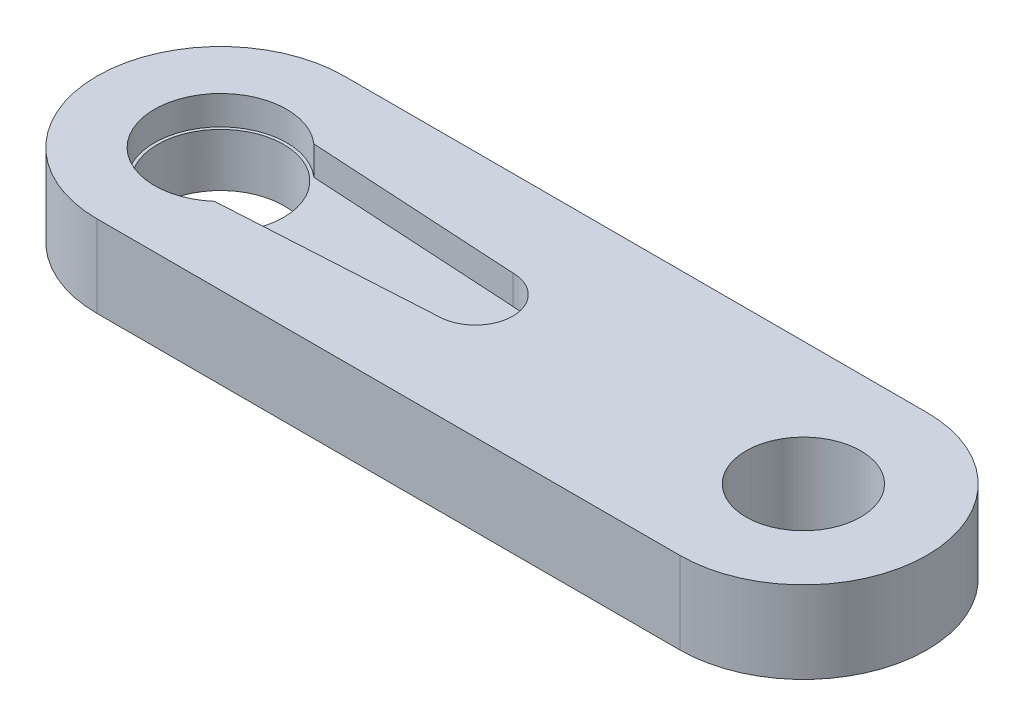
ISO-10303-21;
HEADER;
FILE_DESCRIPTION(('STEP AP214'),'2;1');
FILE_NAME('part.step','',(''),(''),'','','');
FILE_SCHEMA(('AUTOMOTIVE_DESIGN { 1 0 10303 214 1 1 1 1 }'));
ENDSEC;
DATA;
#1=APPLICATION_CONTEXT('core data for automotive mechanical design processes');
#2=APPLICATION_PROTOCOL_DEFINITION('international standard','automotive_design',2000,#1);
#3=PRODUCT_CONTEXT('',#1,'mechanical');
#4=PRODUCT('Part','Part','',(#3));
#5=PRODUCT_RELATED_PRODUCT_CATEGORY('part','',(#4));
#6=PRODUCT_DEFINITION_FORMATION('','',#4);
#7=PRODUCT_DEFINITION_CONTEXT('part definition',#1,'design');
#8=PRODUCT_DEFINITION('design','',#6,#7);
#9=PRODUCT_DEFINITION_SHAPE('','',#8);
#10=(LENGTH_UNIT() NAMED_UNIT(*) SI_UNIT(.MILLI.,.METRE.));
#11=(NAMED_UNIT(*) PLANE_ANGLE_UNIT() SI_UNIT($,.RADIAN.));
#12=(NAMED_UNIT(*) SI_UNIT($,.STERADIAN.) SOLID_ANGLE_UNIT());
#13=UNCERTAINTY_MEASURE_WITH_UNIT(LENGTH_MEASURE(1.E-05),#10,'distance_accuracy_value','');
#14=(GEOMETRIC_REPRESENTATION_CONTEXT(3) GLOBAL_UNCERTAINTY_ASSIGNED_CONTEXT((#13)) GLOBAL_UNIT_ASSIGNED_CONTEXT((#10,
#11,#12)) REPRESENTATION_CONTEXT('',''));
#15=CARTESIAN_POINT('',(0.,0.,0.));
#16=DIRECTION('',(0.,0.,1.));
#17=DIRECTION('',(1.,0.,0.));
#18=AXIS2_PLACEMENT_3D('',#15,#16,#17);
#19=CARTESIAN_POINT('',(33.,3.,0.));
#20=DIRECTION('',(0.,1.,0.));
#21=DIRECTION('',(0.,0.,1.));
#22=AXIS2_PLACEMENT_3D('',#19,#20,#21);
#23=PLANE('',#22);
#24=CARTESIAN_POINT('',(0.,3.,0.));
#25=DIRECTION('',(0.,1.,0.));
#26=DIRECTION('',(0.,0.,1.));
#27=AXIS2_PLACEMENT_3D('',#24,#25,#26);
#28=CIRCLE('',#27,3.575);
#29=CARTESIAN_POINT('',(0.,3.,3.575));
#30=VERTEX_POINT('',#29);
#31=EDGE_CURVE('E180',#30,#30,#28,.T.);
#32=ORIENTED_EDGE('',*,*,#31,.F.);
#33=EDGE_LOOP('',(#32));
#34=FACE_BOUND('',#33,.T.);
#35=DIRECTION('',(0.998310081629833,0.,-0.0581117967045877));
#36=VECTOR('',#35,1.);
#37=CARTESIAN_POINT('',(2.46852452254572,3.,2.81627620832731));
#38=LINE('',#37,#36);
#39=CARTESIAN_POINT('',(2.46852452254572,3.,2.81627620832731));
#40=VERTEX_POINT('',#39);
#41=CARTESIAN_POINT('',(14.4300468804629,3.,2.1199939926796));
#42=VERTEX_POINT('',#41);
#43=EDGE_CURVE('E117',#40,#42,#38,.T.);
#44=ORIENTED_EDGE('',*,*,#43,.T.);
#45=CARTESIAN_POINT('',(14.425,3.,0.));
#46=DIRECTION('',(0.,1.,0.));
#47=DIRECTION('',(0.,0.,1.));
#48=AXIS2_PLACEMENT_3D('',#45,#46,#47);
#49=CIRCLE('',#48,2.12);
#50=CARTESIAN_POINT('',(14.4300468804628,3.,-2.1199939926796));
#51=VERTEX_POINT('',#50);
#52=EDGE_CURVE('E141',#42,#51,#49,.T.);
#53=ORIENTED_EDGE('',*,*,#52,.T.);
#54=DIRECTION('',(-0.998310081629833,0.,-0.0581117967045882));
#55=VECTOR('',#54,1.);
#56=CARTESIAN_POINT('',(14.4300468804628,3.,-2.1199939926796));
#57=LINE('',#56,#55);
#58=CARTESIAN_POINT('',(2.46852452254572,3.,-2.81627620832731));
#59=VERTEX_POINT('',#58);
#60=EDGE_CURVE('E123',#51,#59,#57,.T.);
#61=ORIENTED_EDGE('',*,*,#60,.T.);
#62=CARTESIAN_POINT('',(0.,3.,0.));
#63=DIRECTION('',(0.,1.,0.));
#64=DIRECTION('',(0.,0.,-1.));
#65=AXIS2_PLACEMENT_3D('',#62,#63,#64);
#66=CIRCLE('',#65,3.745);
#67=EDGE_CURVE('E147',#59,#40,#66,.T.);
#68=ORIENTED_EDGE('',*,*,#67,.T.);
#69=EDGE_LOOP('',(#44,#53,#61,#68));
#70=FACE_BOUND('',#69,.T.);
#71=ADVANCED_FACE('F39',(#34,#70),#23,.T.);
#72=CARTESIAN_POINT('',(33.,3.,0.));
#73=DIRECTION('',(0.,-1.,0.));
#74=DIRECTION('',(0.,0.,-1.));
#75=AXIS2_PLACEMENT_3D('',#72,#73,#74);
#76=CYLINDRICAL_SURFACE('',#75,7.);
#77=CARTESIAN_POINT('',(33.,0.,0.));
#78=DIRECTION('',(0.,1.,0.));
#79=DIRECTION('',(0.,0.,1.));
#80=AXIS2_PLACEMENT_3D('',#77,#78,#79);
#81=CIRCLE('',#80,7.);
#82=CARTESIAN_POINT('',(33.,0.,7.));
#83=VERTEX_POINT('',#82);
#84=CARTESIAN_POINT('',(33.,0.,-7.));
#85=VERTEX_POINT('',#84);
#86=EDGE_CURVE('E184',#83,#85,#81,.T.);
#87=ORIENTED_EDGE('',*,*,#86,.T.);
#88=DIRECTION('',(0.,-1.,0.));
#89=VECTOR('',#88,1.);
#90=CARTESIAN_POINT('',(33.,3.,-7.));
#91=LINE('',#90,#89);
#92=CARTESIAN_POINT('',(33.,4.64,-7.));
#93=VERTEX_POINT('',#92);
#94=EDGE_CURVE('E11',#93,#85,#91,.T.);
#95=ORIENTED_EDGE('',*,*,#94,.F.);
#96=CARTESIAN_POINT('',(33.,4.64,0.));
#97=DIRECTION('',(0.,1.,0.));
#98=DIRECTION('',(0.,0.,1.));
#99=AXIS2_PLACEMENT_3D('',#96,#97,#98);
#100=CIRCLE('',#99,7.);
#101=CARTESIAN_POINT('',(33.,4.64,7.));
#102=VERTEX_POINT('',#101);
#103=EDGE_CURVE('E168',#102,#93,#100,.T.);
#104=ORIENTED_EDGE('',*,*,#103,.F.);
#105=DIRECTION('',(0.,-1.,0.));
#106=VECTOR('',#105,1.);
#107=CARTESIAN_POINT('',(33.,3.,7.));
#108=LINE('',#107,#106);
#109=EDGE_CURVE('E196',#102,#83,#108,.T.);
#110=ORIENTED_EDGE('',*,*,#109,.T.);
#111=EDGE_LOOP('',(#87,#95,#104,#110));
#112=FACE_BOUND('',#111,.T.);
#113=ADVANCED_FACE('F41',(#112),#76,.T.);
#114=CARTESIAN_POINT('',(0.,3.,-7.));
#115=DIRECTION('',(0.,0.,1.));
#116=DIRECTION('',(1.,0.,0.));
#117=AXIS2_PLACEMENT_3D('',#114,#115,#116);
#118=PLANE('',#117);
#119=DIRECTION('',(-1.,0.,0.));
#120=VECTOR('',#119,1.);
#121=CARTESIAN_POINT('',(0.,0.,-7.));
#122=LINE('',#121,#120);
#123=CARTESIAN_POINT('',(0.,0.,-7.));
#124=VERTEX_POINT('',#123);
#125=EDGE_CURVE('E188',#85,#124,#122,.T.);
#126=ORIENTED_EDGE('',*,*,#125,.T.);
#127=DIRECTION('',(0.,-1.,0.));
#128=VECTOR('',#127,1.);
#129=CARTESIAN_POINT('',(0.,3.,-7.));
#130=LINE('',#129,#128);
#131=CARTESIAN_POINT('',(0.,4.64,-7.));
#132=VERTEX_POINT('',#131);
#133=EDGE_CURVE('E48',#132,#124,#130,.T.);
#134=ORIENTED_EDGE('',*,*,#133,.F.);
#135=DIRECTION('',(-1.,0.,0.));
#136=VECTOR('',#135,1.);
#137=CARTESIAN_POINT('',(33.,4.64,-7.));
#138=LINE('',#137,#136);
#139=EDGE_CURVE('E172',#93,#132,#138,.T.);
#140=ORIENTED_EDGE('',*,*,#139,.F.);
#141=ORIENTED_EDGE('',*,*,#94,.T.);
#142=EDGE_LOOP('',(#126,#134,#140,#141));
#143=FACE_BOUND('',#142,.T.);
#144=ADVANCED_FACE('F217',(#143),#118,.F.);
#145=CARTESIAN_POINT('',(0.,3.,0.));
#146=DIRECTION('',(0.,-1.,0.));
#147=DIRECTION('',(0.,0.,-1.));
#148=AXIS2_PLACEMENT_3D('',#145,#146,#147);
#149=CYLINDRICAL_SURFACE('',#148,7.);
#150=CARTESIAN_POINT('',(0.,0.,0.));
#151=DIRECTION('',(0.,1.,0.));
#152=DIRECTION('',(0.,0.,1.));
#153=AXIS2_PLACEMENT_3D('',#150,#151,#152);
#154=CIRCLE('',#153,7.);
#155=CARTESIAN_POINT('',(0.,0.,7.));
#156=VERTEX_POINT('',#155);
#157=EDGE_CURVE('E191',#124,#156,#154,.T.);
#158=ORIENTED_EDGE('',*,*,#157,.T.);
#159=DIRECTION('',(0.,-1.,0.));
#160=VECTOR('',#159,1.);
#161=CARTESIAN_POINT('',(0.,3.,7.));
#162=LINE('',#161,#160);
#163=CARTESIAN_POINT('',(0.,4.64,7.));
#164=VERTEX_POINT('',#163);
#165=EDGE_CURVE('E199',#164,#156,#162,.T.);
#166=ORIENTED_EDGE('',*,*,#165,.F.);
#167=CARTESIAN_POINT('',(0.,4.64,0.));
#168=DIRECTION('',(0.,1.,0.));
#169=DIRECTION('',(0.,0.,1.));
#170=AXIS2_PLACEMENT_3D('',#167,#168,#169);
#171=CIRCLE('',#170,7.);
#172=EDGE_CURVE('E125',#132,#164,#171,.T.);
#173=ORIENTED_EDGE('',*,*,#172,.F.);
#174=ORIENTED_EDGE('',*,*,#133,.T.);
#175=EDGE_LOOP('',(#158,#166,#173,#174));
#176=FACE_BOUND('',#175,.T.);
#177=ADVANCED_FACE('F206',(#176),#149,.T.);
#178=CARTESIAN_POINT('',(0.,3.,7.));
#179=DIRECTION('',(0.,0.,-1.));
#180=DIRECTION('',(-1.,0.,0.));
#181=AXIS2_PLACEMENT_3D('',#178,#179,#180);
#182=PLANE('',#181);
#183=DIRECTION('',(1.,0.,0.));
#184=VECTOR('',#183,1.);
#185=CARTESIAN_POINT('',(0.,0.,7.));
#186=LINE('',#185,#184);
#187=EDGE_CURVE('E63',#156,#83,#186,.T.);
#188=ORIENTED_EDGE('',*,*,#187,.T.);
#189=ORIENTED_EDGE('',*,*,#109,.F.);
#190=DIRECTION('',(1.,0.,0.));
#191=VECTOR('',#190,1.);
#192=CARTESIAN_POINT('',(0.,4.64,7.));
#193=LINE('',#192,#191);
#194=EDGE_CURVE('E164',#164,#102,#193,.T.);
#195=ORIENTED_EDGE('',*,*,#194,.F.);
#196=ORIENTED_EDGE('',*,*,#165,.T.);
#197=EDGE_LOOP('',(#188,#189,#195,#196));
#198=FACE_BOUND('',#197,.T.);
#199=ADVANCED_FACE('F215',(#198),#182,.F.);
#200=CARTESIAN_POINT('',(33.,0.,0.));
#201=DIRECTION('',(0.,1.,0.));
#202=DIRECTION('',(0.,0.,1.));
#203=AXIS2_PLACEMENT_3D('',#200,#201,#202);
#204=PLANE('',#203);
#205=CARTESIAN_POINT('',(33.,0.,0.));
#206=DIRECTION('',(0.,1.,0.));
#207=DIRECTION('',(0.,0.,1.));
#208=AXIS2_PLACEMENT_3D('',#205,#206,#207);
#209=CIRCLE('',#208,3.25);
#210=CARTESIAN_POINT('',(33.,0.,3.25));
#211=VERTEX_POINT('',#210);
#212=EDGE_CURVE('E144',#211,#211,#209,.F.);
#213=ORIENTED_EDGE('',*,*,#212,.F.);
#214=EDGE_LOOP('',(#213));
#215=FACE_BOUND('',#214,.T.);
#216=CARTESIAN_POINT('',(0.,0.,0.));
#217=DIRECTION('',(0.,-1.,0.));
#218=DIRECTION('',(0.,0.,-1.));
#219=AXIS2_PLACEMENT_3D('',#216,#217,#218);
#220=CIRCLE('',#219,3.575);
#221=CARTESIAN_POINT('',(0.,0.,-3.575));
#222=VERTEX_POINT('',#221);
#223=EDGE_CURVE('E176',#222,#222,#220,.T.);
#224=ORIENTED_EDGE('',*,*,#223,.F.);
#225=EDGE_LOOP('',(#224));
#226=FACE_BOUND('',#225,.T.);
#227=ORIENTED_EDGE('',*,*,#86,.F.);
#228=ORIENTED_EDGE('',*,*,#187,.F.);
#229=ORIENTED_EDGE('',*,*,#157,.F.);
#230=ORIENTED_EDGE('',*,*,#125,.F.);
#231=EDGE_LOOP('',(#227,#228,#229,#230));
#232=FACE_BOUND('',#231,.T.);
#233=ADVANCED_FACE('F211',(#215,#226,#232),#204,.F.);
#234=CARTESIAN_POINT('',(0.,3.95,0.));
#235=DIRECTION('',(0.,-1.,0.));
#236=DIRECTION('',(0.,0.,-1.));
#237=AXIS2_PLACEMENT_3D('',#234,#235,#236);
#238=CYLINDRICAL_SURFACE('',#237,3.575);
#239=ORIENTED_EDGE('',*,*,#31,.T.);
#240=EDGE_LOOP('',(#239));
#241=FACE_BOUND('',#240,.T.);
#242=ORIENTED_EDGE('',*,*,#223,.T.);
#243=EDGE_LOOP('',(#242));
#244=FACE_BOUND('',#243,.T.);
#245=ADVANCED_FACE('F233',(#241,#244),#238,.F.);
#246=CARTESIAN_POINT('',(0.,4.64,0.));
#247=DIRECTION('',(0.,1.,0.));
#248=DIRECTION('',(0.,0.,1.));
#249=AXIS2_PLACEMENT_3D('',#246,#247,#248);
#250=PLANE('',#249);
#251=CARTESIAN_POINT('',(33.,4.64,0.));
#252=DIRECTION('',(0.,1.,0.));
#253=DIRECTION('',(0.,0.,1.));
#254=AXIS2_PLACEMENT_3D('',#251,#252,#253);
#255=CIRCLE('',#254,3.25);
#256=CARTESIAN_POINT('',(33.,4.64,3.25));
#257=VERTEX_POINT('',#256);
#258=EDGE_CURVE('E349',#257,#257,#255,.T.);
#259=ORIENTED_EDGE('',*,*,#258,.F.);
#260=EDGE_LOOP('',(#259));
#261=FACE_BOUND('',#260,.T.);
#262=ORIENTED_EDGE('',*,*,#172,.T.);
#263=ORIENTED_EDGE('',*,*,#194,.T.);
#264=ORIENTED_EDGE('',*,*,#103,.T.);
#265=ORIENTED_EDGE('',*,*,#139,.T.);
#266=EDGE_LOOP('',(#262,#263,#264,#265));
#267=FACE_BOUND('',#266,.T.);
#268=DIRECTION('',(-0.998310081629833,0.,-0.0581117967045882));
#269=VECTOR('',#268,1.);
#270=CARTESIAN_POINT('',(14.4300468804628,4.64,-2.1199939926796));
#271=LINE('',#270,#269);
#272=CARTESIAN_POINT('',(14.4300468804628,4.64,-2.1199939926796));
#273=VERTEX_POINT('',#272);
#274=CARTESIAN_POINT('',(2.46852452254572,4.64,-2.81627620832731));
#275=VERTEX_POINT('',#274);
#276=EDGE_CURVE('E116',#273,#275,#271,.T.);
#277=ORIENTED_EDGE('',*,*,#276,.F.);
#278=CARTESIAN_POINT('',(14.425,4.64,0.));
#279=DIRECTION('',(0.,1.,0.));
#280=DIRECTION('',(0.,0.,1.));
#281=AXIS2_PLACEMENT_3D('',#278,#279,#280);
#282=CIRCLE('',#281,2.12);
#283=CARTESIAN_POINT('',(14.4300468804629,4.64,2.1199939926796));
#284=VERTEX_POINT('',#283);
#285=EDGE_CURVE('E107',#284,#273,#282,.T.);
#286=ORIENTED_EDGE('',*,*,#285,.F.);
#287=DIRECTION('',(0.998310081629833,0.,-0.0581117967045877));
#288=VECTOR('',#287,1.);
#289=CARTESIAN_POINT('',(2.46852452254572,4.64,2.81627620832731));
#290=LINE('',#289,#288);
#291=CARTESIAN_POINT('',(2.46852452254572,4.64,2.81627620832731));
#292=VERTEX_POINT('',#291);
#293=EDGE_CURVE('E135',#292,#284,#290,.T.);
#294=ORIENTED_EDGE('',*,*,#293,.F.);
#295=CARTESIAN_POINT('',(0.,4.64,0.));
#296=DIRECTION('',(0.,1.,0.));
#297=DIRECTION('',(0.,0.,-1.));
#298=AXIS2_PLACEMENT_3D('',#295,#296,#297);
#299=CIRCLE('',#298,3.745);
#300=EDGE_CURVE('E131',#275,#292,#299,.T.);
#301=ORIENTED_EDGE('',*,*,#300,.F.);
#302=EDGE_LOOP('',(#277,#286,#294,#301));
#303=FACE_BOUND('',#302,.T.);
#304=ADVANCED_FACE('F129',(#261,#267,#303),#250,.T.);
#305=CARTESIAN_POINT('',(14.425,4.64,0.));
#306=DIRECTION('',(0.,-1.,0.));
#307=DIRECTION('',(0.,0.,-1.));
#308=AXIS2_PLACEMENT_3D('',#305,#306,#307);
#309=CYLINDRICAL_SURFACE('',#308,2.12);
#310=ORIENTED_EDGE('',*,*,#52,.F.);
#311=DIRECTION('',(0.,-1.,0.));
#312=VECTOR('',#311,1.);
#313=CARTESIAN_POINT('',(14.4300468804629,4.64,2.1199939926796));
#314=LINE('',#313,#312);
#315=EDGE_CURVE('E55',#284,#42,#314,.T.);
#316=ORIENTED_EDGE('',*,*,#315,.F.);
#317=ORIENTED_EDGE('',*,*,#285,.T.);
#318=DIRECTION('',(0.,-1.,0.));
#319=VECTOR('',#318,1.);
#320=CARTESIAN_POINT('',(14.4300468804628,4.64,-2.1199939926796));
#321=LINE('',#320,#319);
#322=EDGE_CURVE('E110',#273,#51,#321,.T.);
#323=ORIENTED_EDGE('',*,*,#322,.T.);
#324=EDGE_LOOP('',(#310,#316,#317,#323));
#325=FACE_BOUND('',#324,.T.);
#326=ADVANCED_FACE('F109',(#325),#309,.F.);
#327=CARTESIAN_POINT('',(14.4300468804628,4.64,-2.1199939926796));
#328=DIRECTION('',(-0.0581117967045882,0.,0.998310081629833));
#329=DIRECTION('',(0.998310081629833,0.,0.0581117967045882));
#330=AXIS2_PLACEMENT_3D('',#327,#328,#329);
#331=PLANE('',#330);
#332=ORIENTED_EDGE('',*,*,#60,.F.);
#333=ORIENTED_EDGE('',*,*,#322,.F.);
#334=ORIENTED_EDGE('',*,*,#276,.T.);
#335=DIRECTION('',(0.,-1.,0.));
#336=VECTOR('',#335,1.);
#337=CARTESIAN_POINT('',(2.46852452254572,4.64,-2.81627620832731));
#338=LINE('',#337,#336);
#339=EDGE_CURVE('E126',#275,#59,#338,.T.);
#340=ORIENTED_EDGE('',*,*,#339,.T.);
#341=EDGE_LOOP('',(#332,#333,#334,#340));
#342=FACE_BOUND('',#341,.T.);
#343=ADVANCED_FACE('F120',(#342),#331,.T.);
#344=CARTESIAN_POINT('',(0.,4.64,0.));
#345=DIRECTION('',(0.,-1.,0.));
#346=DIRECTION('',(0.,0.,-1.));
#347=AXIS2_PLACEMENT_3D('',#344,#345,#346);
#348=CYLINDRICAL_SURFACE('',#347,3.745);
#349=ORIENTED_EDGE('',*,*,#67,.F.);
#350=ORIENTED_EDGE('',*,*,#339,.F.);
#351=ORIENTED_EDGE('',*,*,#300,.T.);
#352=DIRECTION('',(0.,-1.,0.));
#353=VECTOR('',#352,1.);
#354=CARTESIAN_POINT('',(2.46852452254572,4.64,2.81627620832731));
#355=LINE('',#354,#353);
#356=EDGE_CURVE('E156',#292,#40,#355,.T.);
#357=ORIENTED_EDGE('',*,*,#356,.T.);
#358=EDGE_LOOP('',(#349,#350,#351,#357));
#359=FACE_BOUND('',#358,.T.);
#360=ADVANCED_FACE('F273',(#359),#348,.F.);
#361=CARTESIAN_POINT('',(2.46852452254572,4.64,2.81627620832731));
#362=DIRECTION('',(-0.0581117967045877,0.,-0.998310081629833));
#363=DIRECTION('',(-0.998310081629834,0.,0.0581117967045878));
#364=AXIS2_PLACEMENT_3D('',#361,#362,#363);
#365=PLANE('',#364);
#366=ORIENTED_EDGE('',*,*,#43,.F.);
#367=ORIENTED_EDGE('',*,*,#356,.F.);
#368=ORIENTED_EDGE('',*,*,#293,.T.);
#369=ORIENTED_EDGE('',*,*,#315,.T.);
#370=EDGE_LOOP('',(#366,#367,#368,#369));
#371=FACE_BOUND('',#370,.T.);
#372=ADVANCED_FACE('F280',(#371),#365,.T.);
#373=CARTESIAN_POINT('',(33.,-9.19238815542512,0.));
#374=DIRECTION('',(0.,1.,0.));
#375=DIRECTION('',(0.,0.,1.));
#376=AXIS2_PLACEMENT_3D('',#373,#374,#375);
#377=CYLINDRICAL_SURFACE('',#376,3.25);
#378=CARTESIAN_POINT('',(33.,0.,3.25));
#379=CARTESIAN_POINT('',(33.,0.0483333333333313,3.25));
#380=CARTESIAN_POINT('',(33.,0.0966666666666645,3.25));
#381=CARTESIAN_POINT('',(33.,0.193333333333331,3.25));
#382=CARTESIAN_POINT('',(33.,0.241666666666665,3.25));
#383=CARTESIAN_POINT('',(33.,0.338333333333332,3.25));
#384=CARTESIAN_POINT('',(33.,0.386666666666665,3.25));
#385=CARTESIAN_POINT('',(33.,0.483333333333332,3.25));
#386=CARTESIAN_POINT('',(33.,0.531666666666665,3.25));
#387=CARTESIAN_POINT('',(33.,0.628333333333332,3.25));
#388=CARTESIAN_POINT('',(33.,0.676666666666665,3.25));
#389=CARTESIAN_POINT('',(33.,0.773333333333332,3.25));
#390=CARTESIAN_POINT('',(33.,0.821666666666666,3.25));
#391=CARTESIAN_POINT('',(33.,0.918333333333332,3.25));
#392=CARTESIAN_POINT('',(33.,0.966666666666665,3.25));
#393=CARTESIAN_POINT('',(33.,1.06333333333333,3.25));
#394=CARTESIAN_POINT('',(33.,1.11166666666667,3.25));
#395=CARTESIAN_POINT('',(33.,1.20833333333333,3.25));
#396=CARTESIAN_POINT('',(33.,1.25666666666667,3.25));
#397=CARTESIAN_POINT('',(33.,1.35333333333333,3.25));
#398=CARTESIAN_POINT('',(33.,1.40166666666667,3.25));
#399=CARTESIAN_POINT('',(33.,1.49833333333333,3.25));
#400=CARTESIAN_POINT('',(33.,1.54666666666667,3.25));
#401=CARTESIAN_POINT('',(33.,1.64333333333333,3.25));
#402=CARTESIAN_POINT('',(33.,1.69166666666667,3.25));
#403=CARTESIAN_POINT('',(33.,1.78833333333333,3.25));
#404=CARTESIAN_POINT('',(33.,1.83666666666667,3.25));
#405=CARTESIAN_POINT('',(33.,1.93333333333333,3.25));
#406=CARTESIAN_POINT('',(33.,1.98166666666667,3.25));
#407=CARTESIAN_POINT('',(33.,2.07833333333333,3.25));
#408=CARTESIAN_POINT('',(33.,2.12666666666667,3.25));
#409=CARTESIAN_POINT('',(33.,2.22333333333333,3.25));
#410=CARTESIAN_POINT('',(33.,2.27166666666667,3.25));
#411=CARTESIAN_POINT('',(33.,2.36833333333333,3.25));
#412=CARTESIAN_POINT('',(33.,2.41666666666667,3.25));
#413=CARTESIAN_POINT('',(33.,2.51333333333333,3.25));
#414=CARTESIAN_POINT('',(33.,2.56166666666667,3.25));
#415=CARTESIAN_POINT('',(33.,2.65833333333333,3.25));
#416=CARTESIAN_POINT('',(33.,2.70666666666667,3.25));
#417=CARTESIAN_POINT('',(33.,2.80333333333333,3.25));
#418=CARTESIAN_POINT('',(33.,2.85166666666667,3.25));
#419=CARTESIAN_POINT('',(33.,2.94833333333333,3.25));
#420=CARTESIAN_POINT('',(33.,2.99666666666667,3.25));
#421=CARTESIAN_POINT('',(33.,3.09333333333333,3.25));
#422=CARTESIAN_POINT('',(33.,3.14166666666667,3.25));
#423=CARTESIAN_POINT('',(33.,3.23833333333333,3.25));
#424=CARTESIAN_POINT('',(33.,3.28666666666667,3.25));
#425=CARTESIAN_POINT('',(33.,3.38333333333333,3.25));
#426=CARTESIAN_POINT('',(33.,3.43166666666667,3.25));
#427=CARTESIAN_POINT('',(33.,3.52833333333333,3.25));
#428=CARTESIAN_POINT('',(33.,3.57666666666667,3.25));
#429=CARTESIAN_POINT('',(33.,3.67333333333333,3.25));
#430=CARTESIAN_POINT('',(33.,3.72166666666667,3.25));
#431=CARTESIAN_POINT('',(33.,3.81833333333333,3.25));
#432=CARTESIAN_POINT('',(33.,3.86666666666667,3.25));
#433=CARTESIAN_POINT('',(33.,3.96333333333333,3.25));
#434=CARTESIAN_POINT('',(33.,4.01166666666667,3.25));
#435=CARTESIAN_POINT('',(33.,4.10833333333333,3.25));
#436=CARTESIAN_POINT('',(33.,4.15666666666667,3.25));
#437=CARTESIAN_POINT('',(33.,4.25333333333333,3.25));
#438=CARTESIAN_POINT('',(33.,4.30166666666667,3.25));
#439=CARTESIAN_POINT('',(33.,4.39833333333333,3.25));
#440=CARTESIAN_POINT('',(33.,4.44666666666667,3.25));
#441=CARTESIAN_POINT('',(33.,4.54333333333333,3.25));
#442=CARTESIAN_POINT('',(33.,4.59166666666667,3.25));
#443=CARTESIAN_POINT('',(33.,4.64,3.25));
#444=B_SPLINE_CURVE_WITH_KNOTS('',3,(#378,#379,#380,#381,#382,#383,#384,#385,#386,#387,#388,
#389,#390,#391,#392,#393,#394,#395,#396,#397,#398,#399,#400,#401,#402,#403,#404,#405,#406,#407,
#408,#409,#410,#411,#412,#413,#414,#415,#416,#417,#418,#419,#420,#421,#422,#423,#424,#425,#426,
#427,#428,#429,#430,#431,#432,#433,#434,#435,#436,#437,#438,#439,#440,#441,#442,#443),
.UNSPECIFIED.,.F.,.F.,(4,2,2,2,2,2,2,2,2,2,2,2,2,2,2,2,2,2,2,2,2,2,2,2,2,2,2,2,2,2,2,2,4),(0.,
0.144999999999999,0.29,0.435,0.580000000000001,0.725,0.870000000000001,1.015,1.16,1.305,1.45,
1.595,1.74,1.885,2.03,2.175,2.32,2.465,2.61,2.755,2.9,3.045,3.19,3.335,3.48,3.625,3.77,3.915,
4.06,4.205,4.35,4.495,4.64),.UNSPECIFIED.);
#445=EDGE_CURVE('BSEAM287',#211,#257,#444,.T.);
#446=ORIENTED_EDGE('',*,*,#212,.T.);
#447=ORIENTED_EDGE('',*,*,#258,.T.);
#448=ORIENTED_EDGE('',*,*,#445,.T.);
#449=ORIENTED_EDGE('',*,*,#445,.F.);
#450=EDGE_LOOP('',(#446,#448,#447,#449));
#451=FACE_BOUND('',#450,.T.);
#452=ADVANCED_FACE('F287',(#451),#377,.F.);
#453=CLOSED_SHELL('',(#71,#113,#144,#177,#199,#233,#245,#304,#326,#343,#360,#372,#452));
#454=MANIFOLD_SOLID_BREP('B2',#453);
#455=ADVANCED_BREP_SHAPE_REPRESENTATION('',(#18,#454),#14);
#456=SHAPE_DEFINITION_REPRESENTATION(#9,#455);
ENDSEC;
END-ISO-10303-21;
